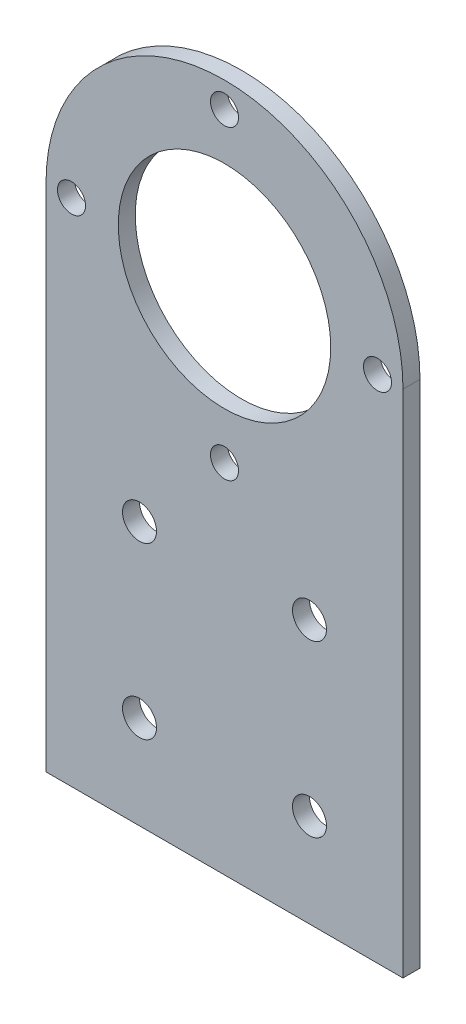
ISO-10303-21;
HEADER;
FILE_DESCRIPTION(('STEP AP214'),'2;1');
FILE_NAME('part.step','',(''),(''),'','','');
FILE_SCHEMA(('AUTOMOTIVE_DESIGN { 1 0 10303 214 1 1 1 1 }'));
ENDSEC;
DATA;
#1=APPLICATION_CONTEXT('core data for automotive mechanical design processes');
#2=APPLICATION_PROTOCOL_DEFINITION('international standard','automotive_design',2000,#1);
#3=PRODUCT_CONTEXT('',#1,'mechanical');
#4=PRODUCT('Part','Part','',(#3));
#5=PRODUCT_RELATED_PRODUCT_CATEGORY('part','',(#4));
#6=PRODUCT_DEFINITION_FORMATION('','',#4);
#7=PRODUCT_DEFINITION_CONTEXT('part definition',#1,'design');
#8=PRODUCT_DEFINITION('design','',#6,#7);
#9=PRODUCT_DEFINITION_SHAPE('','',#8);
#10=(LENGTH_UNIT() NAMED_UNIT(*) SI_UNIT(.MILLI.,.METRE.));
#11=(NAMED_UNIT(*) PLANE_ANGLE_UNIT() SI_UNIT($,.RADIAN.));
#12=(NAMED_UNIT(*) SI_UNIT($,.STERADIAN.) SOLID_ANGLE_UNIT());
#13=UNCERTAINTY_MEASURE_WITH_UNIT(LENGTH_MEASURE(1.E-05),#10,'distance_accuracy_value','');
#14=(GEOMETRIC_REPRESENTATION_CONTEXT(3) GLOBAL_UNCERTAINTY_ASSIGNED_CONTEXT((#13)) GLOBAL_UNIT_ASSIGNED_CONTEXT((#10,
#11,#12)) REPRESENTATION_CONTEXT('',''));
#15=CARTESIAN_POINT('',(0.,0.,0.));
#16=DIRECTION('',(0.,0.,1.));
#17=DIRECTION('',(1.,0.,0.));
#18=AXIS2_PLACEMENT_3D('',#15,#16,#17);
#19=CARTESIAN_POINT('',(0.,0.,2.));
#20=DIRECTION('',(0.,0.,-1.));
#21=DIRECTION('',(-1.,0.,0.));
#22=AXIS2_PLACEMENT_3D('',#19,#20,#21);
#23=CYLINDRICAL_SURFACE('',#22,21.);
#24=CARTESIAN_POINT('',(0.,0.,0.));
#25=DIRECTION('',(0.,0.,1.));
#26=DIRECTION('',(1.,0.,0.));
#27=AXIS2_PLACEMENT_3D('',#24,#25,#26);
#28=CIRCLE('',#27,21.);
#29=CARTESIAN_POINT('',(21.,0.,0.));
#30=VERTEX_POINT('',#29);
#31=CARTESIAN_POINT('',(-21.,0.,0.));
#32=VERTEX_POINT('',#31);
#33=EDGE_CURVE('E99',#30,#32,#28,.T.);
#34=ORIENTED_EDGE('',*,*,#33,.T.);
#35=DIRECTION('',(0.,0.,-1.));
#36=VECTOR('',#35,1.);
#37=CARTESIAN_POINT('',(-21.,0.,2.));
#38=LINE('',#37,#36);
#39=CARTESIAN_POINT('',(-21.,0.,2.));
#40=VERTEX_POINT('',#39);
#41=EDGE_CURVE('E11',#40,#32,#38,.T.);
#42=ORIENTED_EDGE('',*,*,#41,.F.);
#43=CARTESIAN_POINT('',(0.,0.,2.));
#44=DIRECTION('',(0.,0.,1.));
#45=DIRECTION('',(1.,0.,0.));
#46=AXIS2_PLACEMENT_3D('',#43,#44,#45);
#47=CIRCLE('',#46,21.);
#48=CARTESIAN_POINT('',(21.,0.,2.));
#49=VERTEX_POINT('',#48);
#50=EDGE_CURVE('E85',#49,#40,#47,.T.);
#51=ORIENTED_EDGE('',*,*,#50,.F.);
#52=DIRECTION('',(0.,0.,-1.));
#53=VECTOR('',#52,1.);
#54=CARTESIAN_POINT('',(21.,0.,2.));
#55=LINE('',#54,#53);
#56=EDGE_CURVE('E52',#49,#30,#55,.T.);
#57=ORIENTED_EDGE('',*,*,#56,.T.);
#58=EDGE_LOOP('',(#34,#42,#51,#57));
#59=FACE_BOUND('',#58,.T.);
#60=ADVANCED_FACE('F36',(#59),#23,.T.);
#61=CARTESIAN_POINT('',(-21.,0.,2.));
#62=DIRECTION('',(1.,0.,0.));
#63=DIRECTION('',(0.,1.,0.));
#64=AXIS2_PLACEMENT_3D('',#61,#62,#63);
#65=PLANE('',#64);
#66=DIRECTION('',(0.,-1.,0.));
#67=VECTOR('',#66,1.);
#68=CARTESIAN_POINT('',(-21.,0.,0.));
#69=LINE('',#68,#67);
#70=CARTESIAN_POINT('',(-21.,-60.,0.));
#71=VERTEX_POINT('',#70);
#72=EDGE_CURVE('E90',#32,#71,#69,.T.);
#73=ORIENTED_EDGE('',*,*,#72,.T.);
#74=DIRECTION('',(0.,0.,-1.));
#75=VECTOR('',#74,1.);
#76=CARTESIAN_POINT('',(-21.,-60.,2.));
#77=LINE('',#76,#75);
#78=CARTESIAN_POINT('',(-21.,-60.,2.));
#79=VERTEX_POINT('',#78);
#80=EDGE_CURVE('E44',#79,#71,#77,.T.);
#81=ORIENTED_EDGE('',*,*,#80,.F.);
#82=DIRECTION('',(0.,-1.,0.));
#83=VECTOR('',#82,1.);
#84=CARTESIAN_POINT('',(-21.,0.,2.));
#85=LINE('',#84,#83);
#86=EDGE_CURVE('E78',#40,#79,#85,.T.);
#87=ORIENTED_EDGE('',*,*,#86,.F.);
#88=ORIENTED_EDGE('',*,*,#41,.T.);
#89=EDGE_LOOP('',(#73,#81,#87,#88));
#90=FACE_BOUND('',#89,.T.);
#91=ADVANCED_FACE('F89',(#90),#65,.F.);
#92=CARTESIAN_POINT('',(-21.,-60.,2.));
#93=DIRECTION('',(0.,1.,0.));
#94=DIRECTION('',(0.,0.,1.));
#95=AXIS2_PLACEMENT_3D('',#92,#93,#94);
#96=PLANE('',#95);
#97=DIRECTION('',(1.,0.,0.));
#98=VECTOR('',#97,1.);
#99=CARTESIAN_POINT('',(-21.,-60.,0.));
#100=LINE('',#99,#98);
#101=CARTESIAN_POINT('',(21.,-60.,0.));
#102=VERTEX_POINT('',#101);
#103=EDGE_CURVE('E103',#71,#102,#100,.T.);
#104=ORIENTED_EDGE('',*,*,#103,.T.);
#105=DIRECTION('',(0.,0.,-1.));
#106=VECTOR('',#105,1.);
#107=CARTESIAN_POINT('',(21.,-60.,2.));
#108=LINE('',#107,#106);
#109=CARTESIAN_POINT('',(21.,-60.,2.));
#110=VERTEX_POINT('',#109);
#111=EDGE_CURVE('E67',#110,#102,#108,.T.);
#112=ORIENTED_EDGE('',*,*,#111,.F.);
#113=DIRECTION('',(1.,0.,0.));
#114=VECTOR('',#113,1.);
#115=CARTESIAN_POINT('',(-21.,-60.,2.));
#116=LINE('',#115,#114);
#117=EDGE_CURVE('E84',#79,#110,#116,.T.);
#118=ORIENTED_EDGE('',*,*,#117,.F.);
#119=ORIENTED_EDGE('',*,*,#80,.T.);
#120=EDGE_LOOP('',(#104,#112,#118,#119));
#121=FACE_BOUND('',#120,.T.);
#122=ADVANCED_FACE('F93',(#121),#96,.F.);
#123=CARTESIAN_POINT('',(21.,0.,2.));
#124=DIRECTION('',(1.,0.,0.));
#125=DIRECTION('',(0.,1.,0.));
#126=AXIS2_PLACEMENT_3D('',#123,#124,#125);
#127=PLANE('',#126);
#128=DIRECTION('',(0.,-1.,0.));
#129=VECTOR('',#128,1.);
#130=CARTESIAN_POINT('',(21.,0.,0.));
#131=LINE('',#130,#129);
#132=EDGE_CURVE('E105',#30,#102,#131,.T.);
#133=ORIENTED_EDGE('',*,*,#132,.F.);
#134=ORIENTED_EDGE('',*,*,#56,.F.);
#135=DIRECTION('',(0.,-1.,0.));
#136=VECTOR('',#135,1.);
#137=CARTESIAN_POINT('',(21.,0.,2.));
#138=LINE('',#137,#136);
#139=EDGE_CURVE('E94',#49,#110,#138,.T.);
#140=ORIENTED_EDGE('',*,*,#139,.T.);
#141=ORIENTED_EDGE('',*,*,#111,.T.);
#142=EDGE_LOOP('',(#133,#134,#140,#141));
#143=FACE_BOUND('',#142,.T.);
#144=ADVANCED_FACE('F178',(#143),#127,.T.);
#145=CARTESIAN_POINT('',(0.,0.,2.));
#146=DIRECTION('',(0.,0.,1.));
#147=DIRECTION('',(1.,0.,0.));
#148=AXIS2_PLACEMENT_3D('',#145,#146,#147);
#149=PLANE('',#148);
#150=CARTESIAN_POINT('',(-10.,-49.,2.));
#151=DIRECTION('',(0.,0.,1.));
#152=DIRECTION('',(1.,0.,0.));
#153=AXIS2_PLACEMENT_3D('',#150,#151,#152);
#154=CIRCLE('',#153,2.);
#155=CARTESIAN_POINT('',(-8.,-49.,2.));
#156=VERTEX_POINT('',#155);
#157=EDGE_CURVE('E147',#156,#156,#154,.T.);
#158=ORIENTED_EDGE('',*,*,#157,.F.);
#159=EDGE_LOOP('',(#158));
#160=FACE_BOUND('',#159,.T.);
#161=CARTESIAN_POINT('',(10.,-49.,2.));
#162=DIRECTION('',(0.,0.,1.));
#163=DIRECTION('',(1.,0.,0.));
#164=AXIS2_PLACEMENT_3D('',#161,#162,#163);
#165=CIRCLE('',#164,2.);
#166=CARTESIAN_POINT('',(12.,-49.,2.));
#167=VERTEX_POINT('',#166);
#168=EDGE_CURVE('E153',#167,#167,#165,.T.);
#169=ORIENTED_EDGE('',*,*,#168,.F.);
#170=EDGE_LOOP('',(#169));
#171=FACE_BOUND('',#170,.T.);
#172=CARTESIAN_POINT('',(10.,-29.,2.));
#173=DIRECTION('',(0.,0.,1.));
#174=DIRECTION('',(1.,0.,0.));
#175=AXIS2_PLACEMENT_3D('',#172,#173,#174);
#176=CIRCLE('',#175,2.);
#177=CARTESIAN_POINT('',(12.,-29.,2.));
#178=VERTEX_POINT('',#177);
#179=EDGE_CURVE('E159',#178,#178,#176,.T.);
#180=ORIENTED_EDGE('',*,*,#179,.F.);
#181=EDGE_LOOP('',(#180));
#182=FACE_BOUND('',#181,.T.);
#183=CARTESIAN_POINT('',(-10.,-29.,2.));
#184=DIRECTION('',(0.,0.,1.));
#185=DIRECTION('',(1.,0.,0.));
#186=AXIS2_PLACEMENT_3D('',#183,#184,#185);
#187=CIRCLE('',#186,2.);
#188=CARTESIAN_POINT('',(-8.,-29.,2.));
#189=VERTEX_POINT('',#188);
#190=EDGE_CURVE('E141',#189,#189,#187,.T.);
#191=ORIENTED_EDGE('',*,*,#190,.F.);
#192=EDGE_LOOP('',(#191));
#193=FACE_BOUND('',#192,.T.);
#194=CARTESIAN_POINT('',(0.,0.,2.));
#195=DIRECTION('',(0.,0.,1.));
#196=DIRECTION('',(1.,0.,0.));
#197=AXIS2_PLACEMENT_3D('',#194,#195,#196);
#198=CIRCLE('',#197,12.5);
#199=CARTESIAN_POINT('',(12.5,0.,2.));
#200=VERTEX_POINT('',#199);
#201=EDGE_CURVE('E135',#200,#200,#198,.T.);
#202=ORIENTED_EDGE('',*,*,#201,.F.);
#203=EDGE_LOOP('',(#202));
#204=FACE_BOUND('',#203,.T.);
#205=CARTESIAN_POINT('',(-18.,0.,2.));
#206=DIRECTION('',(0.,0.,1.));
#207=DIRECTION('',(1.,0.,0.));
#208=AXIS2_PLACEMENT_3D('',#205,#206,#207);
#209=CIRCLE('',#208,1.65);
#210=CARTESIAN_POINT('',(-16.35,0.,2.));
#211=VERTEX_POINT('',#210);
#212=EDGE_CURVE('E130',#211,#211,#209,.T.);
#213=ORIENTED_EDGE('',*,*,#212,.F.);
#214=EDGE_LOOP('',(#213));
#215=FACE_BOUND('',#214,.T.);
#216=CARTESIAN_POINT('',(18.,0.,2.));
#217=DIRECTION('',(0.,0.,1.));
#218=DIRECTION('',(1.,0.,0.));
#219=AXIS2_PLACEMENT_3D('',#216,#217,#218);
#220=CIRCLE('',#219,1.65);
#221=CARTESIAN_POINT('',(19.65,0.,2.));
#222=VERTEX_POINT('',#221);
#223=EDGE_CURVE('E124',#222,#222,#220,.T.);
#224=ORIENTED_EDGE('',*,*,#223,.F.);
#225=EDGE_LOOP('',(#224));
#226=FACE_BOUND('',#225,.T.);
#227=CARTESIAN_POINT('',(0.,18.,2.));
#228=DIRECTION('',(0.,0.,1.));
#229=DIRECTION('',(1.,0.,0.));
#230=AXIS2_PLACEMENT_3D('',#227,#228,#229);
#231=CIRCLE('',#230,1.65);
#232=CARTESIAN_POINT('',(1.65,18.,2.));
#233=VERTEX_POINT('',#232);
#234=EDGE_CURVE('E118',#233,#233,#231,.T.);
#235=ORIENTED_EDGE('',*,*,#234,.F.);
#236=EDGE_LOOP('',(#235));
#237=FACE_BOUND('',#236,.T.);
#238=CARTESIAN_POINT('',(0.,-18.,2.));
#239=DIRECTION('',(0.,0.,1.));
#240=DIRECTION('',(1.,0.,0.));
#241=AXIS2_PLACEMENT_3D('',#238,#239,#240);
#242=CIRCLE('',#241,1.65);
#243=CARTESIAN_POINT('',(1.65,-18.,2.));
#244=VERTEX_POINT('',#243);
#245=EDGE_CURVE('E111',#244,#244,#242,.T.);
#246=ORIENTED_EDGE('',*,*,#245,.F.);
#247=EDGE_LOOP('',(#246));
#248=FACE_BOUND('',#247,.T.);
#249=ORIENTED_EDGE('',*,*,#50,.T.);
#250=ORIENTED_EDGE('',*,*,#86,.T.);
#251=ORIENTED_EDGE('',*,*,#117,.T.);
#252=ORIENTED_EDGE('',*,*,#139,.F.);
#253=EDGE_LOOP('',(#249,#250,#251,#252));
#254=FACE_BOUND('',#253,.T.);
#255=ADVANCED_FACE('F81',(#160,#171,#182,#193,#204,#215,#226,#237,#248,#254),#149,.T.);
#256=CARTESIAN_POINT('',(0.,0.,0.));
#257=DIRECTION('',(0.,0.,1.));
#258=DIRECTION('',(1.,0.,0.));
#259=AXIS2_PLACEMENT_3D('',#256,#257,#258);
#260=PLANE('',#259);
#261=CARTESIAN_POINT('',(-10.,-49.,0.));
#262=DIRECTION('',(0.,0.,1.));
#263=DIRECTION('',(1.,0.,0.));
#264=AXIS2_PLACEMENT_3D('',#261,#262,#263);
#265=CIRCLE('',#264,2.);
#266=CARTESIAN_POINT('',(-8.,-49.,0.));
#267=VERTEX_POINT('',#266);
#268=EDGE_CURVE('E150',#267,#267,#265,.T.);
#269=ORIENTED_EDGE('',*,*,#268,.T.);
#270=EDGE_LOOP('',(#269));
#271=FACE_BOUND('',#270,.T.);
#272=CARTESIAN_POINT('',(10.,-49.,0.));
#273=DIRECTION('',(0.,0.,1.));
#274=DIRECTION('',(1.,0.,0.));
#275=AXIS2_PLACEMENT_3D('',#272,#273,#274);
#276=CIRCLE('',#275,2.);
#277=CARTESIAN_POINT('',(12.,-49.,0.));
#278=VERTEX_POINT('',#277);
#279=EDGE_CURVE('E156',#278,#278,#276,.T.);
#280=ORIENTED_EDGE('',*,*,#279,.T.);
#281=EDGE_LOOP('',(#280));
#282=FACE_BOUND('',#281,.T.);
#283=CARTESIAN_POINT('',(10.,-29.,0.));
#284=DIRECTION('',(0.,0.,1.));
#285=DIRECTION('',(1.,0.,0.));
#286=AXIS2_PLACEMENT_3D('',#283,#284,#285);
#287=CIRCLE('',#286,2.);
#288=CARTESIAN_POINT('',(12.,-29.,0.));
#289=VERTEX_POINT('',#288);
#290=EDGE_CURVE('E144',#289,#289,#287,.T.);
#291=ORIENTED_EDGE('',*,*,#290,.T.);
#292=EDGE_LOOP('',(#291));
#293=FACE_BOUND('',#292,.T.);
#294=CARTESIAN_POINT('',(-10.,-29.,0.));
#295=DIRECTION('',(0.,0.,1.));
#296=DIRECTION('',(1.,0.,0.));
#297=AXIS2_PLACEMENT_3D('',#294,#295,#296);
#298=CIRCLE('',#297,2.);
#299=CARTESIAN_POINT('',(-8.,-29.,0.));
#300=VERTEX_POINT('',#299);
#301=EDGE_CURVE('E138',#300,#300,#298,.T.);
#302=ORIENTED_EDGE('',*,*,#301,.T.);
#303=EDGE_LOOP('',(#302));
#304=FACE_BOUND('',#303,.T.);
#305=CARTESIAN_POINT('',(0.,0.,0.));
#306=DIRECTION('',(0.,0.,1.));
#307=DIRECTION('',(1.,0.,0.));
#308=AXIS2_PLACEMENT_3D('',#305,#306,#307);
#309=CIRCLE('',#308,12.5);
#310=CARTESIAN_POINT('',(12.5,0.,0.));
#311=VERTEX_POINT('',#310);
#312=EDGE_CURVE('E115',#311,#311,#309,.T.);
#313=ORIENTED_EDGE('',*,*,#312,.T.);
#314=EDGE_LOOP('',(#313));
#315=FACE_BOUND('',#314,.T.);
#316=CARTESIAN_POINT('',(-18.,0.,0.));
#317=DIRECTION('',(0.,0.,1.));
#318=DIRECTION('',(1.,0.,0.));
#319=AXIS2_PLACEMENT_3D('',#316,#317,#318);
#320=CIRCLE('',#319,1.65);
#321=CARTESIAN_POINT('',(-16.35,0.,0.));
#322=VERTEX_POINT('',#321);
#323=EDGE_CURVE('E101',#322,#322,#320,.T.);
#324=ORIENTED_EDGE('',*,*,#323,.T.);
#325=EDGE_LOOP('',(#324));
#326=FACE_BOUND('',#325,.T.);
#327=CARTESIAN_POINT('',(18.,0.,0.));
#328=DIRECTION('',(0.,0.,1.));
#329=DIRECTION('',(1.,0.,0.));
#330=AXIS2_PLACEMENT_3D('',#327,#328,#329);
#331=CIRCLE('',#330,1.65);
#332=CARTESIAN_POINT('',(19.65,0.,0.));
#333=VERTEX_POINT('',#332);
#334=EDGE_CURVE('E127',#333,#333,#331,.T.);
#335=ORIENTED_EDGE('',*,*,#334,.T.);
#336=EDGE_LOOP('',(#335));
#337=FACE_BOUND('',#336,.T.);
#338=CARTESIAN_POINT('',(0.,18.,0.));
#339=DIRECTION('',(0.,0.,1.));
#340=DIRECTION('',(1.,0.,0.));
#341=AXIS2_PLACEMENT_3D('',#338,#339,#340);
#342=CIRCLE('',#341,1.65);
#343=CARTESIAN_POINT('',(1.65,18.,0.));
#344=VERTEX_POINT('',#343);
#345=EDGE_CURVE('E121',#344,#344,#342,.T.);
#346=ORIENTED_EDGE('',*,*,#345,.T.);
#347=EDGE_LOOP('',(#346));
#348=FACE_BOUND('',#347,.T.);
#349=CARTESIAN_POINT('',(0.,-18.,0.));
#350=DIRECTION('',(0.,0.,1.));
#351=DIRECTION('',(1.,0.,0.));
#352=AXIS2_PLACEMENT_3D('',#349,#350,#351);
#353=CIRCLE('',#352,1.65);
#354=CARTESIAN_POINT('',(1.65,-18.,0.));
#355=VERTEX_POINT('',#354);
#356=EDGE_CURVE('E114',#355,#355,#353,.T.);
#357=ORIENTED_EDGE('',*,*,#356,.T.);
#358=EDGE_LOOP('',(#357));
#359=FACE_BOUND('',#358,.T.);
#360=ORIENTED_EDGE('',*,*,#33,.F.);
#361=ORIENTED_EDGE('',*,*,#132,.T.);
#362=ORIENTED_EDGE('',*,*,#103,.F.);
#363=ORIENTED_EDGE('',*,*,#72,.F.);
#364=EDGE_LOOP('',(#360,#361,#362,#363));
#365=FACE_BOUND('',#364,.T.);
#366=ADVANCED_FACE('F165',(#271,#282,#293,#304,#315,#326,#337,#348,#359,#365),#260,.F.);
#367=CARTESIAN_POINT('',(0.,-18.,0.));
#368=DIRECTION('',(0.,0.,1.));
#369=DIRECTION('',(1.,0.,0.));
#370=AXIS2_PLACEMENT_3D('',#367,#368,#369);
#371=CYLINDRICAL_SURFACE('',#370,1.65);
#372=ORIENTED_EDGE('',*,*,#356,.F.);
#373=EDGE_LOOP('',(#372));
#374=FACE_BOUND('',#373,.T.);
#375=ORIENTED_EDGE('',*,*,#245,.T.);
#376=EDGE_LOOP('',(#375));
#377=FACE_BOUND('',#376,.T.);
#378=ADVANCED_FACE('F193',(#374,#377),#371,.F.);
#379=CARTESIAN_POINT('',(0.,18.,0.));
#380=DIRECTION('',(0.,0.,1.));
#381=DIRECTION('',(1.,0.,0.));
#382=AXIS2_PLACEMENT_3D('',#379,#380,#381);
#383=CYLINDRICAL_SURFACE('',#382,1.65);
#384=ORIENTED_EDGE('',*,*,#345,.F.);
#385=EDGE_LOOP('',(#384));
#386=FACE_BOUND('',#385,.T.);
#387=ORIENTED_EDGE('',*,*,#234,.T.);
#388=EDGE_LOOP('',(#387));
#389=FACE_BOUND('',#388,.T.);
#390=ADVANCED_FACE('F195',(#386,#389),#383,.F.);
#391=CARTESIAN_POINT('',(18.,0.,0.));
#392=DIRECTION('',(0.,0.,1.));
#393=DIRECTION('',(1.,0.,0.));
#394=AXIS2_PLACEMENT_3D('',#391,#392,#393);
#395=CYLINDRICAL_SURFACE('',#394,1.65);
#396=ORIENTED_EDGE('',*,*,#334,.F.);
#397=EDGE_LOOP('',(#396));
#398=FACE_BOUND('',#397,.T.);
#399=ORIENTED_EDGE('',*,*,#223,.T.);
#400=EDGE_LOOP('',(#399));
#401=FACE_BOUND('',#400,.T.);
#402=ADVANCED_FACE('F202',(#398,#401),#395,.F.);
#403=CARTESIAN_POINT('',(-18.,0.,0.));
#404=DIRECTION('',(0.,0.,1.));
#405=DIRECTION('',(1.,0.,0.));
#406=AXIS2_PLACEMENT_3D('',#403,#404,#405);
#407=CYLINDRICAL_SURFACE('',#406,1.65);
#408=ORIENTED_EDGE('',*,*,#323,.F.);
#409=EDGE_LOOP('',(#408));
#410=FACE_BOUND('',#409,.T.);
#411=ORIENTED_EDGE('',*,*,#212,.T.);
#412=EDGE_LOOP('',(#411));
#413=FACE_BOUND('',#412,.T.);
#414=ADVANCED_FACE('F263',(#410,#413),#407,.F.);
#415=CARTESIAN_POINT('',(0.,0.,0.));
#416=DIRECTION('',(0.,0.,1.));
#417=DIRECTION('',(1.,0.,0.));
#418=AXIS2_PLACEMENT_3D('',#415,#416,#417);
#419=CYLINDRICAL_SURFACE('',#418,12.5);
#420=ORIENTED_EDGE('',*,*,#312,.F.);
#421=EDGE_LOOP('',(#420));
#422=FACE_BOUND('',#421,.T.);
#423=ORIENTED_EDGE('',*,*,#201,.T.);
#424=EDGE_LOOP('',(#423));
#425=FACE_BOUND('',#424,.T.);
#426=ADVANCED_FACE('F272',(#422,#425),#419,.F.);
#427=CARTESIAN_POINT('',(-10.,-29.,0.));
#428=DIRECTION('',(0.,0.,1.));
#429=DIRECTION('',(1.,0.,0.));
#430=AXIS2_PLACEMENT_3D('',#427,#428,#429);
#431=CYLINDRICAL_SURFACE('',#430,2.);
#432=ORIENTED_EDGE('',*,*,#301,.F.);
#433=EDGE_LOOP('',(#432));
#434=FACE_BOUND('',#433,.T.);
#435=ORIENTED_EDGE('',*,*,#190,.T.);
#436=EDGE_LOOP('',(#435));
#437=FACE_BOUND('',#436,.T.);
#438=ADVANCED_FACE('F172',(#434,#437),#431,.F.);
#439=CARTESIAN_POINT('',(10.,-29.,0.));
#440=DIRECTION('',(0.,0.,1.));
#441=DIRECTION('',(1.,0.,0.));
#442=AXIS2_PLACEMENT_3D('',#439,#440,#441);
#443=CYLINDRICAL_SURFACE('',#442,2.);
#444=ORIENTED_EDGE('',*,*,#290,.F.);
#445=EDGE_LOOP('',(#444));
#446=FACE_BOUND('',#445,.T.);
#447=ORIENTED_EDGE('',*,*,#179,.T.);
#448=EDGE_LOOP('',(#447));
#449=FACE_BOUND('',#448,.T.);
#450=ADVANCED_FACE('F168',(#446,#449),#443,.F.);
#451=CARTESIAN_POINT('',(10.,-49.,0.));
#452=DIRECTION('',(0.,0.,1.));
#453=DIRECTION('',(1.,0.,0.));
#454=AXIS2_PLACEMENT_3D('',#451,#452,#453);
#455=CYLINDRICAL_SURFACE('',#454,2.);
#456=ORIENTED_EDGE('',*,*,#279,.F.);
#457=EDGE_LOOP('',(#456));
#458=FACE_BOUND('',#457,.T.);
#459=ORIENTED_EDGE('',*,*,#168,.T.);
#460=EDGE_LOOP('',(#459));
#461=FACE_BOUND('',#460,.T.);
#462=ADVANCED_FACE('F171',(#458,#461),#455,.F.);
#463=CARTESIAN_POINT('',(-10.,-49.,0.));
#464=DIRECTION('',(0.,0.,1.));
#465=DIRECTION('',(1.,0.,0.));
#466=AXIS2_PLACEMENT_3D('',#463,#464,#465);
#467=CYLINDRICAL_SURFACE('',#466,2.);
#468=ORIENTED_EDGE('',*,*,#268,.F.);
#469=EDGE_LOOP('',(#468));
#470=FACE_BOUND('',#469,.T.);
#471=ORIENTED_EDGE('',*,*,#157,.T.);
#472=EDGE_LOOP('',(#471));
#473=FACE_BOUND('',#472,.T.);
#474=ADVANCED_FACE('F302',(#470,#473),#467,.F.);
#475=CLOSED_SHELL('',(#60,#91,#122,#144,#255,#366,#378,#390,#402,#414,#426,#438,#450,#462,#474));
#476=MANIFOLD_SOLID_BREP('B2',#475);
#477=ADVANCED_BREP_SHAPE_REPRESENTATION('',(#18,#476),#14);
#478=SHAPE_DEFINITION_REPRESENTATION(#9,#477);
ENDSEC;
END-ISO-10303-21;
